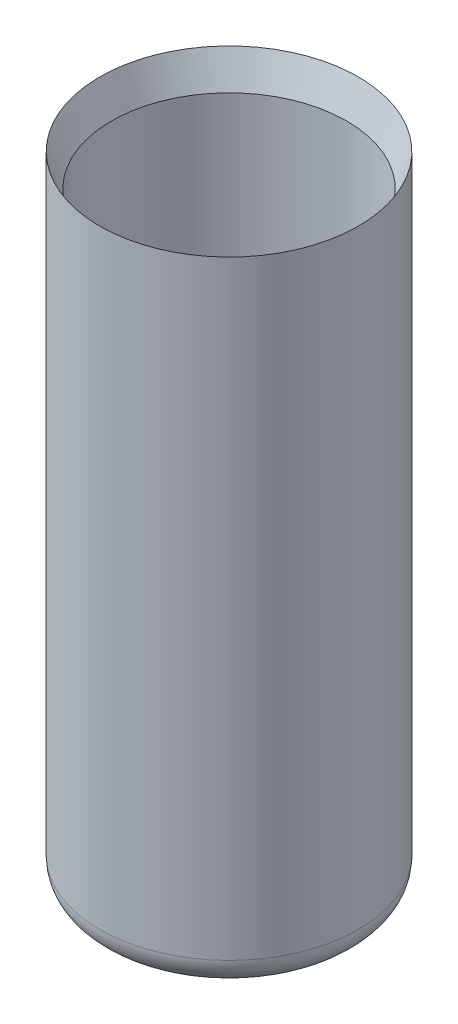
ISO-10303-21;
HEADER;
FILE_DESCRIPTION(('STEP AP214'),'2;1');
FILE_NAME('part.step','',(''),(''),'','','');
FILE_SCHEMA(('AUTOMOTIVE_DESIGN { 1 0 10303 214 1 1 1 1 }'));
ENDSEC;
DATA;
#1=APPLICATION_CONTEXT('core data for automotive mechanical design processes');
#2=APPLICATION_PROTOCOL_DEFINITION('international standard','automotive_design',2000,#1);
#3=PRODUCT_CONTEXT('',#1,'mechanical');
#4=PRODUCT('Part','Part','',(#3));
#5=PRODUCT_RELATED_PRODUCT_CATEGORY('part','',(#4));
#6=PRODUCT_DEFINITION_FORMATION('','',#4);
#7=PRODUCT_DEFINITION_CONTEXT('part definition',#1,'design');
#8=PRODUCT_DEFINITION('design','',#6,#7);
#9=PRODUCT_DEFINITION_SHAPE('','',#8);
#10=(LENGTH_UNIT() NAMED_UNIT(*) SI_UNIT(.MILLI.,.METRE.));
#11=(NAMED_UNIT(*) PLANE_ANGLE_UNIT() SI_UNIT($,.RADIAN.));
#12=(NAMED_UNIT(*) SI_UNIT($,.STERADIAN.) SOLID_ANGLE_UNIT());
#13=UNCERTAINTY_MEASURE_WITH_UNIT(LENGTH_MEASURE(1.E-05),#10,'distance_accuracy_value','');
#14=(GEOMETRIC_REPRESENTATION_CONTEXT(3) GLOBAL_UNCERTAINTY_ASSIGNED_CONTEXT((#13)) GLOBAL_UNIT_ASSIGNED_CONTEXT((#10,
#11,#12)) REPRESENTATION_CONTEXT('',''));
#15=CARTESIAN_POINT('',(0.,0.,0.));
#16=DIRECTION('',(0.,0.,1.));
#17=DIRECTION('',(1.,0.,0.));
#18=AXIS2_PLACEMENT_3D('',#15,#16,#17);
#19=CARTESIAN_POINT('',(0.,-10.,0.));
#20=DIRECTION('',(0.,1.,0.));
#21=DIRECTION('',(0.,0.,1.));
#22=AXIS2_PLACEMENT_3D('',#19,#20,#21);
#23=PLANE('',#22);
#24=DIRECTION('',(1.,0.,0.));
#25=VECTOR('',#24,1.);
#26=CARTESIAN_POINT('',(0.,-10.,-7.25));
#27=LINE('',#26,#25);
#28=CARTESIAN_POINT('',(-2.1650635094611,-10.,-7.25));
#29=VERTEX_POINT('',#28);
#30=CARTESIAN_POINT('',(2.1650635094611,-10.,-7.25));
#31=VERTEX_POINT('',#30);
#32=EDGE_CURVE('E142',#29,#31,#27,.T.);
#33=ORIENTED_EDGE('',*,*,#32,.F.);
#34=CARTESIAN_POINT('',(0.,-10.,-6.));
#35=DIRECTION('',(0.,-1.,0.));
#36=DIRECTION('',(0.,0.,-1.));
#37=AXIS2_PLACEMENT_3D('',#34,#35,#36);
#38=CIRCLE('',#37,2.5);
#39=CARTESIAN_POINT('',(-2.1650635094611,-10.,-4.75));
#40=VERTEX_POINT('',#39);
#41=EDGE_CURVE('E139',#40,#29,#38,.T.);
#42=ORIENTED_EDGE('',*,*,#41,.F.);
#43=DIRECTION('',(1.,0.,0.));
#44=VECTOR('',#43,1.);
#45=CARTESIAN_POINT('',(0.,-10.,-4.75));
#46=LINE('',#45,#44);
#47=CARTESIAN_POINT('',(2.1650635094611,-10.,-4.75));
#48=VERTEX_POINT('',#47);
#49=EDGE_CURVE('E64',#40,#48,#46,.T.);
#50=ORIENTED_EDGE('',*,*,#49,.T.);
#51=EDGE_CURVE('E59',#31,#48,#38,.T.);
#52=ORIENTED_EDGE('',*,*,#51,.F.);
#53=EDGE_LOOP('',(#33,#42,#50,#52));
#54=FACE_BOUND('',#53,.T.);
#55=CARTESIAN_POINT('',(0.,-10.,0.));
#56=DIRECTION('',(0.,1.,0.));
#57=DIRECTION('',(0.,0.,1.));
#58=AXIS2_PLACEMENT_3D('',#55,#56,#57);
#59=CIRCLE('',#58,17.);
#60=CARTESIAN_POINT('',(0.,-10.,17.));
#61=VERTEX_POINT('',#60);
#62=EDGE_CURVE('E206',#61,#61,#59,.F.);
#63=ORIENTED_EDGE('',*,*,#62,.T.);
#64=EDGE_LOOP('',(#63));
#65=FACE_BOUND('',#64,.T.);
#66=DIRECTION('',(0.,0.,-1.));
#67=VECTOR('',#66,1.);
#68=CARTESIAN_POINT('',(-2.5,-10.,0.));
#69=LINE('',#68,#67);
#70=CARTESIAN_POINT('',(-2.5,-10.,10.1698729810778));
#71=VERTEX_POINT('',#70);
#72=CARTESIAN_POINT('',(-2.5,-10.,0.));
#73=VERTEX_POINT('',#72);
#74=EDGE_CURVE('E143',#71,#73,#69,.T.);
#75=ORIENTED_EDGE('',*,*,#74,.F.);
#76=DIRECTION('',(-0.5,0.,-0.866025403784439));
#77=VECTOR('',#76,1.);
#78=CARTESIAN_POINT('',(-6.27868417743718,-10.,3.625));
#79=LINE('',#78,#77);
#80=CARTESIAN_POINT('',(-2.1650635094611,-10.,10.75));
#81=VERTEX_POINT('',#80);
#82=EDGE_CURVE('E156',#81,#71,#79,.T.);
#83=ORIENTED_EDGE('',*,*,#82,.F.);
#84=CARTESIAN_POINT('',(0.,-10.,9.5));
#85=DIRECTION('',(0.,-1.,0.));
#86=DIRECTION('',(0.,0.,-1.));
#87=AXIS2_PLACEMENT_3D('',#84,#85,#86);
#88=CIRCLE('',#87,2.5);
#89=CARTESIAN_POINT('',(2.16506350946109,-10.,10.75));
#90=VERTEX_POINT('',#89);
#91=EDGE_CURVE('E175',#90,#81,#88,.T.);
#92=ORIENTED_EDGE('',*,*,#91,.F.);
#93=DIRECTION('',(-0.5,0.,0.866025403784439));
#94=VECTOR('',#93,1.);
#95=CARTESIAN_POINT('',(6.27868417743718,-10.,3.625));
#96=LINE('',#95,#94);
#97=CARTESIAN_POINT('',(2.5,-10.,10.1698729810778));
#98=VERTEX_POINT('',#97);
#99=EDGE_CURVE('E172',#98,#90,#96,.T.);
#100=ORIENTED_EDGE('',*,*,#99,.F.);
#101=DIRECTION('',(0.,0.,1.));
#102=VECTOR('',#101,1.);
#103=CARTESIAN_POINT('',(2.5,-10.,0.));
#104=LINE('',#103,#102);
#105=CARTESIAN_POINT('',(2.5,-10.,0.));
#106=VERTEX_POINT('',#105);
#107=EDGE_CURVE('E169',#106,#98,#104,.T.);
#108=ORIENTED_EDGE('',*,*,#107,.F.);
#109=CARTESIAN_POINT('',(0.,-10.,0.));
#110=DIRECTION('',(0.,-1.,0.));
#111=DIRECTION('',(0.,0.,-1.));
#112=AXIS2_PLACEMENT_3D('',#109,#110,#111);
#113=CIRCLE('',#112,2.5);
#114=EDGE_CURVE('E146',#73,#106,#113,.T.);
#115=ORIENTED_EDGE('',*,*,#114,.F.);
#116=EDGE_LOOP('',(#75,#83,#92,#100,#108,#115));
#117=FACE_BOUND('',#116,.T.);
#118=ADVANCED_FACE('F43',(#54,#65,#117),#23,.F.);
#119=CARTESIAN_POINT('',(0.,-10.,0.));
#120=DIRECTION('',(0.,1.,0.));
#121=DIRECTION('',(0.,0.,1.));
#122=AXIS2_PLACEMENT_3D('',#119,#120,#121);
#123=CYLINDRICAL_SURFACE('',#122,22.);
#124=CARTESIAN_POINT('',(0.,98.6262612902726,0.));
#125=DIRECTION('',(0.,1.,0.));
#126=DIRECTION('',(0.,0.,1.));
#127=AXIS2_PLACEMENT_3D('',#124,#125,#126);
#128=CIRCLE('',#127,22.);
#129=CARTESIAN_POINT('',(0.,98.6262612902726,22.));
#130=VERTEX_POINT('',#129);
#131=EDGE_CURVE('E11',#130,#130,#128,.F.);
#132=ORIENTED_EDGE('',*,*,#131,.T.);
#133=EDGE_LOOP('',(#132));
#134=FACE_BOUND('',#133,.T.);
#135=CARTESIAN_POINT('',(0.,-5.,0.));
#136=DIRECTION('',(0.,1.,0.));
#137=DIRECTION('',(0.,0.,1.));
#138=AXIS2_PLACEMENT_3D('',#135,#136,#137);
#139=CIRCLE('',#138,22.);
#140=CARTESIAN_POINT('',(0.,-5.,22.));
#141=VERTEX_POINT('',#140);
#142=EDGE_CURVE('E203',#141,#141,#139,.T.);
#143=ORIENTED_EDGE('',*,*,#142,.T.);
#144=EDGE_LOOP('',(#143));
#145=FACE_BOUND('',#144,.T.);
#146=ADVANCED_FACE('F223',(#134,#145),#123,.T.);
#147=CARTESIAN_POINT('',(0.,100.,0.));
#148=DIRECTION('',(0.,-1.,0.));
#149=DIRECTION('',(0.,0.,-1.));
#150=AXIS2_PLACEMENT_3D('',#147,#148,#149);
#151=CYLINDRICAL_SURFACE('',#150,20.);
#152=CARTESIAN_POINT('',(0.,93.1313064513632,0.));
#153=DIRECTION('',(0.,1.,0.));
#154=DIRECTION('',(0.,0.,1.));
#155=AXIS2_PLACEMENT_3D('',#152,#153,#154);
#156=CIRCLE('',#155,20.);
#157=CARTESIAN_POINT('',(0.,93.1313064513632,20.));
#158=VERTEX_POINT('',#157);
#159=EDGE_CURVE('E52',#158,#158,#156,.T.);
#160=ORIENTED_EDGE('',*,*,#159,.T.);
#161=EDGE_LOOP('',(#160));
#162=FACE_BOUND('',#161,.T.);
#163=CARTESIAN_POINT('',(0.,5.,0.));
#164=DIRECTION('',(0.,1.,0.));
#165=DIRECTION('',(0.,0.,1.));
#166=AXIS2_PLACEMENT_3D('',#163,#164,#165);
#167=CIRCLE('',#166,20.);
#168=CARTESIAN_POINT('',(0.,5.,20.));
#169=VERTEX_POINT('',#168);
#170=EDGE_CURVE('E197',#169,#169,#167,.F.);
#171=ORIENTED_EDGE('',*,*,#170,.T.);
#172=EDGE_LOOP('',(#171));
#173=FACE_BOUND('',#172,.T.);
#174=ADVANCED_FACE('F211',(#162,#173),#151,.F.);
#175=CARTESIAN_POINT('',(0.,0.,0.));
#176=DIRECTION('',(0.,1.,0.));
#177=DIRECTION('',(0.,0.,1.));
#178=AXIS2_PLACEMENT_3D('',#175,#176,#177);
#179=PLANE('',#178);
#180=CARTESIAN_POINT('',(0.,0.,0.));
#181=DIRECTION('',(0.,1.,0.));
#182=DIRECTION('',(0.,0.,1.));
#183=AXIS2_PLACEMENT_3D('',#180,#181,#182);
#184=CIRCLE('',#183,15.);
#185=CARTESIAN_POINT('',(0.,0.,15.));
#186=VERTEX_POINT('',#185);
#187=EDGE_CURVE('E200',#186,#186,#184,.T.);
#188=ORIENTED_EDGE('',*,*,#187,.T.);
#189=EDGE_LOOP('',(#188));
#190=FACE_BOUND('',#189,.T.);
#191=ADVANCED_FACE('F234',(#190),#179,.T.);
#192=CARTESIAN_POINT('',(0.,5.,0.));
#193=DIRECTION('',(0.,1.,0.));
#194=DIRECTION('',(0.,0.,1.));
#195=AXIS2_PLACEMENT_3D('',#192,#193,#194);
#196=TOROIDAL_SURFACE('',#195,15.,5.);
#197=ORIENTED_EDGE('',*,*,#187,.F.);
#198=EDGE_LOOP('',(#197));
#199=FACE_BOUND('',#198,.T.);
#200=ORIENTED_EDGE('',*,*,#170,.F.);
#201=EDGE_LOOP('',(#200));
#202=FACE_BOUND('',#201,.T.);
#203=ADVANCED_FACE('F236',(#199,#202),#196,.F.);
#204=CARTESIAN_POINT('',(0.,-5.,0.));
#205=DIRECTION('',(0.,1.,0.));
#206=DIRECTION('',(0.,0.,1.));
#207=AXIS2_PLACEMENT_3D('',#204,#205,#206);
#208=TOROIDAL_SURFACE('',#207,17.,5.);
#209=ORIENTED_EDGE('',*,*,#62,.F.);
#210=EDGE_LOOP('',(#209));
#211=FACE_BOUND('',#210,.T.);
#212=ORIENTED_EDGE('',*,*,#142,.F.);
#213=EDGE_LOOP('',(#212));
#214=FACE_BOUND('',#213,.T.);
#215=ADVANCED_FACE('F240',(#211,#214),#208,.T.);
#216=CARTESIAN_POINT('',(-2.5,-12.,0.));
#217=DIRECTION('',(1.,0.,0.));
#218=DIRECTION('',(0.,0.,-1.));
#219=AXIS2_PLACEMENT_3D('',#216,#217,#218);
#220=PLANE('',#219);
#221=ORIENTED_EDGE('',*,*,#74,.T.);
#222=DIRECTION('',(0.,1.,0.));
#223=VECTOR('',#222,1.);
#224=CARTESIAN_POINT('',(-2.5,-12.,0.));
#225=LINE('',#224,#223);
#226=CARTESIAN_POINT('',(-2.5,-12.,0.));
#227=VERTEX_POINT('',#226);
#228=EDGE_CURVE('E194',#227,#73,#225,.T.);
#229=ORIENTED_EDGE('',*,*,#228,.F.);
#230=DIRECTION('',(0.,0.,-1.));
#231=VECTOR('',#230,1.);
#232=CARTESIAN_POINT('',(-2.5,-12.,0.));
#233=LINE('',#232,#231);
#234=CARTESIAN_POINT('',(-2.5,-12.,10.1698729810778));
#235=VERTEX_POINT('',#234);
#236=EDGE_CURVE('E152',#235,#227,#233,.T.);
#237=ORIENTED_EDGE('',*,*,#236,.F.);
#238=DIRECTION('',(0.,1.,0.));
#239=VECTOR('',#238,1.);
#240=CARTESIAN_POINT('',(-2.5,-12.,10.1698729810778));
#241=LINE('',#240,#239);
#242=EDGE_CURVE('E165',#235,#71,#241,.T.);
#243=ORIENTED_EDGE('',*,*,#242,.T.);
#244=EDGE_LOOP('',(#221,#229,#237,#243));
#245=FACE_BOUND('',#244,.T.);
#246=ADVANCED_FACE('F243',(#245),#220,.F.);
#247=CARTESIAN_POINT('',(0.,-12.,0.));
#248=DIRECTION('',(0.,1.,0.));
#249=DIRECTION('',(0.,0.,1.));
#250=AXIS2_PLACEMENT_3D('',#247,#248,#249);
#251=CYLINDRICAL_SURFACE('',#250,2.5);
#252=ORIENTED_EDGE('',*,*,#114,.T.);
#253=DIRECTION('',(0.,1.,0.));
#254=VECTOR('',#253,1.);
#255=CARTESIAN_POINT('',(2.5,-12.,0.));
#256=LINE('',#255,#254);
#257=CARTESIAN_POINT('',(2.5,-12.,0.));
#258=VERTEX_POINT('',#257);
#259=EDGE_CURVE('E191',#258,#106,#256,.T.);
#260=ORIENTED_EDGE('',*,*,#259,.F.);
#261=CARTESIAN_POINT('',(0.,-12.,0.));
#262=DIRECTION('',(0.,-1.,0.));
#263=DIRECTION('',(0.,0.,-1.));
#264=AXIS2_PLACEMENT_3D('',#261,#262,#263);
#265=CIRCLE('',#264,2.5);
#266=EDGE_CURVE('E155',#227,#258,#265,.T.);
#267=ORIENTED_EDGE('',*,*,#266,.F.);
#268=ORIENTED_EDGE('',*,*,#228,.T.);
#269=EDGE_LOOP('',(#252,#260,#267,#268));
#270=FACE_BOUND('',#269,.T.);
#271=ADVANCED_FACE('F248',(#270),#251,.T.);
#272=CARTESIAN_POINT('',(2.5,-12.,0.));
#273=DIRECTION('',(-1.,0.,0.));
#274=DIRECTION('',(0.,0.,1.));
#275=AXIS2_PLACEMENT_3D('',#272,#273,#274);
#276=PLANE('',#275);
#277=ORIENTED_EDGE('',*,*,#107,.T.);
#278=DIRECTION('',(0.,1.,0.));
#279=VECTOR('',#278,1.);
#280=CARTESIAN_POINT('',(2.5,-12.,10.1698729810778));
#281=LINE('',#280,#279);
#282=CARTESIAN_POINT('',(2.5,-12.,10.1698729810778));
#283=VERTEX_POINT('',#282);
#284=EDGE_CURVE('E188',#283,#98,#281,.T.);
#285=ORIENTED_EDGE('',*,*,#284,.F.);
#286=DIRECTION('',(0.,0.,1.));
#287=VECTOR('',#286,1.);
#288=CARTESIAN_POINT('',(2.5,-12.,0.));
#289=LINE('',#288,#287);
#290=EDGE_CURVE('E158',#258,#283,#289,.T.);
#291=ORIENTED_EDGE('',*,*,#290,.F.);
#292=ORIENTED_EDGE('',*,*,#259,.T.);
#293=EDGE_LOOP('',(#277,#285,#291,#292));
#294=FACE_BOUND('',#293,.T.);
#295=ADVANCED_FACE('F275',(#294),#276,.F.);
#296=CARTESIAN_POINT('',(6.27868417743718,-12.,3.625));
#297=DIRECTION('',(-0.866025403784439,0.,-0.5));
#298=DIRECTION('',(-0.5,0.,0.866025403784439));
#299=AXIS2_PLACEMENT_3D('',#296,#297,#298);
#300=PLANE('',#299);
#301=ORIENTED_EDGE('',*,*,#99,.T.);
#302=DIRECTION('',(0.,1.,0.));
#303=VECTOR('',#302,1.);
#304=CARTESIAN_POINT('',(2.1650635094611,-12.,10.75));
#305=LINE('',#304,#303);
#306=CARTESIAN_POINT('',(2.1650635094611,-12.,10.75));
#307=VERTEX_POINT('',#306);
#308=EDGE_CURVE('E185',#307,#90,#305,.T.);
#309=ORIENTED_EDGE('',*,*,#308,.F.);
#310=DIRECTION('',(-0.5,0.,0.866025403784439));
#311=VECTOR('',#310,1.);
#312=CARTESIAN_POINT('',(6.27868417743718,-12.,3.625));
#313=LINE('',#312,#311);
#314=EDGE_CURVE('E160',#283,#307,#313,.T.);
#315=ORIENTED_EDGE('',*,*,#314,.F.);
#316=ORIENTED_EDGE('',*,*,#284,.T.);
#317=EDGE_LOOP('',(#301,#309,#315,#316));
#318=FACE_BOUND('',#317,.T.);
#319=ADVANCED_FACE('F271',(#318),#300,.F.);
#320=CARTESIAN_POINT('',(0.,-12.,9.5));
#321=DIRECTION('',(0.,1.,0.));
#322=DIRECTION('',(0.,0.,1.));
#323=AXIS2_PLACEMENT_3D('',#320,#321,#322);
#324=CYLINDRICAL_SURFACE('',#323,2.5);
#325=ORIENTED_EDGE('',*,*,#91,.T.);
#326=DIRECTION('',(0.,1.,0.));
#327=VECTOR('',#326,1.);
#328=CARTESIAN_POINT('',(-2.1650635094611,-12.,10.75));
#329=LINE('',#328,#327);
#330=CARTESIAN_POINT('',(-2.1650635094611,-12.,10.75));
#331=VERTEX_POINT('',#330);
#332=EDGE_CURVE('E182',#331,#81,#329,.T.);
#333=ORIENTED_EDGE('',*,*,#332,.F.);
#334=CARTESIAN_POINT('',(0.,-12.,9.5));
#335=DIRECTION('',(0.,-1.,0.));
#336=DIRECTION('',(0.,0.,-1.));
#337=AXIS2_PLACEMENT_3D('',#334,#335,#336);
#338=CIRCLE('',#337,2.5);
#339=EDGE_CURVE('E162',#307,#331,#338,.T.);
#340=ORIENTED_EDGE('',*,*,#339,.F.);
#341=ORIENTED_EDGE('',*,*,#308,.T.);
#342=EDGE_LOOP('',(#325,#333,#340,#341));
#343=FACE_BOUND('',#342,.T.);
#344=ADVANCED_FACE('F269',(#343),#324,.T.);
#345=CARTESIAN_POINT('',(-6.27868417743718,-12.,3.625));
#346=DIRECTION('',(0.866025403784439,0.,-0.5));
#347=DIRECTION('',(-0.5,0.,-0.866025403784439));
#348=AXIS2_PLACEMENT_3D('',#345,#346,#347);
#349=PLANE('',#348);
#350=ORIENTED_EDGE('',*,*,#82,.T.);
#351=ORIENTED_EDGE('',*,*,#242,.F.);
#352=DIRECTION('',(-0.5,0.,-0.866025403784439));
#353=VECTOR('',#352,1.);
#354=CARTESIAN_POINT('',(-6.27868417743718,-12.,3.625));
#355=LINE('',#354,#353);
#356=EDGE_CURVE('E164',#331,#235,#355,.T.);
#357=ORIENTED_EDGE('',*,*,#356,.F.);
#358=ORIENTED_EDGE('',*,*,#332,.T.);
#359=EDGE_LOOP('',(#350,#351,#357,#358));
#360=FACE_BOUND('',#359,.T.);
#361=ADVANCED_FACE('F258',(#360),#349,.F.);
#362=CARTESIAN_POINT('',(0.,-12.,0.));
#363=DIRECTION('',(0.,-1.,0.));
#364=DIRECTION('',(0.,0.,-1.));
#365=AXIS2_PLACEMENT_3D('',#362,#363,#364);
#366=PLANE('',#365);
#367=ORIENTED_EDGE('',*,*,#236,.T.);
#368=ORIENTED_EDGE('',*,*,#266,.T.);
#369=ORIENTED_EDGE('',*,*,#290,.T.);
#370=ORIENTED_EDGE('',*,*,#314,.T.);
#371=ORIENTED_EDGE('',*,*,#339,.T.);
#372=ORIENTED_EDGE('',*,*,#356,.T.);
#373=EDGE_LOOP('',(#367,#368,#369,#370,#371,#372));
#374=FACE_BOUND('',#373,.T.);
#375=ADVANCED_FACE('F263',(#374),#366,.T.);
#376=CARTESIAN_POINT('',(0.,-12.,-7.25));
#377=DIRECTION('',(0.,0.,1.));
#378=DIRECTION('',(1.,0.,0.));
#379=AXIS2_PLACEMENT_3D('',#376,#377,#378);
#380=PLANE('',#379);
#381=ORIENTED_EDGE('',*,*,#32,.T.);
#382=DIRECTION('',(0.,1.,0.));
#383=VECTOR('',#382,1.);
#384=CARTESIAN_POINT('',(2.1650635094611,-12.,-7.25));
#385=LINE('',#384,#383);
#386=CARTESIAN_POINT('',(2.1650635094611,-12.,-7.25));
#387=VERTEX_POINT('',#386);
#388=EDGE_CURVE('E123',#387,#31,#385,.T.);
#389=ORIENTED_EDGE('',*,*,#388,.F.);
#390=DIRECTION('',(1.,0.,0.));
#391=VECTOR('',#390,1.);
#392=CARTESIAN_POINT('',(0.,-12.,-7.25));
#393=LINE('',#392,#391);
#394=CARTESIAN_POINT('',(-2.1650635094611,-12.,-7.25));
#395=VERTEX_POINT('',#394);
#396=EDGE_CURVE('E130',#395,#387,#393,.T.);
#397=ORIENTED_EDGE('',*,*,#396,.F.);
#398=DIRECTION('',(0.,1.,0.));
#399=VECTOR('',#398,1.);
#400=CARTESIAN_POINT('',(-2.1650635094611,-12.,-7.25));
#401=LINE('',#400,#399);
#402=EDGE_CURVE('E492',#395,#29,#401,.T.);
#403=ORIENTED_EDGE('',*,*,#402,.T.);
#404=EDGE_LOOP('',(#381,#389,#397,#403));
#405=FACE_BOUND('',#404,.T.);
#406=ADVANCED_FACE('F141',(#405),#380,.F.);
#407=CARTESIAN_POINT('',(0.,-12.,-6.));
#408=DIRECTION('',(0.,1.,0.));
#409=DIRECTION('',(0.,0.,1.));
#410=AXIS2_PLACEMENT_3D('',#407,#408,#409);
#411=CYLINDRICAL_SURFACE('',#410,2.5);
#412=ORIENTED_EDGE('',*,*,#51,.T.);
#413=DIRECTION('',(0.,1.,0.));
#414=VECTOR('',#413,1.);
#415=CARTESIAN_POINT('',(2.1650635094611,-12.,-4.75));
#416=LINE('',#415,#414);
#417=CARTESIAN_POINT('',(2.1650635094611,-12.,-4.75));
#418=VERTEX_POINT('',#417);
#419=EDGE_CURVE('E125',#418,#48,#416,.T.);
#420=ORIENTED_EDGE('',*,*,#419,.F.);
#421=CARTESIAN_POINT('',(0.,-12.,-6.));
#422=DIRECTION('',(0.,-1.,0.));
#423=DIRECTION('',(0.,0.,-1.));
#424=AXIS2_PLACEMENT_3D('',#421,#422,#423);
#425=CIRCLE('',#424,2.5);
#426=EDGE_CURVE('E119',#387,#418,#425,.T.);
#427=ORIENTED_EDGE('',*,*,#426,.F.);
#428=ORIENTED_EDGE('',*,*,#388,.T.);
#429=EDGE_LOOP('',(#412,#420,#427,#428));
#430=FACE_BOUND('',#429,.T.);
#431=ADVANCED_FACE('F121',(#430),#411,.T.);
#432=CARTESIAN_POINT('',(0.,-12.,-4.75));
#433=DIRECTION('',(0.,0.,1.));
#434=DIRECTION('',(1.,0.,0.));
#435=AXIS2_PLACEMENT_3D('',#432,#433,#434);
#436=PLANE('',#435);
#437=ORIENTED_EDGE('',*,*,#49,.F.);
#438=DIRECTION('',(0.,1.,0.));
#439=VECTOR('',#438,1.);
#440=CARTESIAN_POINT('',(-2.1650635094611,-12.,-4.75));
#441=LINE('',#440,#439);
#442=CARTESIAN_POINT('',(-2.1650635094611,-12.,-4.75));
#443=VERTEX_POINT('',#442);
#444=EDGE_CURVE('E148',#443,#40,#441,.T.);
#445=ORIENTED_EDGE('',*,*,#444,.F.);
#446=DIRECTION('',(1.,0.,0.));
#447=VECTOR('',#446,1.);
#448=CARTESIAN_POINT('',(0.,-12.,-4.75));
#449=LINE('',#448,#447);
#450=EDGE_CURVE('E129',#443,#418,#449,.T.);
#451=ORIENTED_EDGE('',*,*,#450,.T.);
#452=ORIENTED_EDGE('',*,*,#419,.T.);
#453=EDGE_LOOP('',(#437,#445,#451,#452));
#454=FACE_BOUND('',#453,.T.);
#455=ADVANCED_FACE('F294',(#454),#436,.T.);
#456=ORIENTED_EDGE('',*,*,#41,.T.);
#457=ORIENTED_EDGE('',*,*,#402,.F.);
#458=EDGE_CURVE('E132',#443,#395,#425,.T.);
#459=ORIENTED_EDGE('',*,*,#458,.F.);
#460=ORIENTED_EDGE('',*,*,#444,.T.);
#461=EDGE_LOOP('',(#456,#457,#459,#460));
#462=FACE_BOUND('',#461,.T.);
#463=ADVANCED_FACE('F219',(#462),#411,.T.);
#464=CARTESIAN_POINT('',(0.,-12.,0.));
#465=DIRECTION('',(0.,-1.,0.));
#466=DIRECTION('',(0.,0.,-1.));
#467=AXIS2_PLACEMENT_3D('',#464,#465,#466);
#468=PLANE('',#467);
#469=ORIENTED_EDGE('',*,*,#396,.T.);
#470=ORIENTED_EDGE('',*,*,#426,.T.);
#471=ORIENTED_EDGE('',*,*,#450,.F.);
#472=ORIENTED_EDGE('',*,*,#458,.T.);
#473=EDGE_LOOP('',(#469,#470,#471,#472));
#474=FACE_BOUND('',#473,.T.);
#475=ADVANCED_FACE('F134',(#474),#468,.T.);
#476=CARTESIAN_POINT('',(0.,93.1313064513632,0.));
#477=DIRECTION('',(0.,1.,0.));
#478=DIRECTION('',(0.,0.,1.));
#479=AXIS2_PLACEMENT_3D('',#476,#477,#478);
#480=CONICAL_SURFACE('',#479,20.,0.349065850398862);
#481=ORIENTED_EDGE('',*,*,#131,.F.);
#482=EDGE_LOOP('',(#481));
#483=FACE_BOUND('',#482,.T.);
#484=ORIENTED_EDGE('',*,*,#159,.F.);
#485=EDGE_LOOP('',(#484));
#486=FACE_BOUND('',#485,.T.);
#487=ADVANCED_FACE('F46',(#483,#486),#480,.F.);
#488=CLOSED_SHELL('',(#118,#146,#174,#191,#203,#215,#246,#271,#295,#319,#344,#361,#375,#406,
#431,#455,#463,#475,#487));
#489=MANIFOLD_SOLID_BREP('B2',#488);
#490=ADVANCED_BREP_SHAPE_REPRESENTATION('',(#18,#489),#14);
#491=SHAPE_DEFINITION_REPRESENTATION(#9,#490);
ENDSEC;
END-ISO-10303-21;
